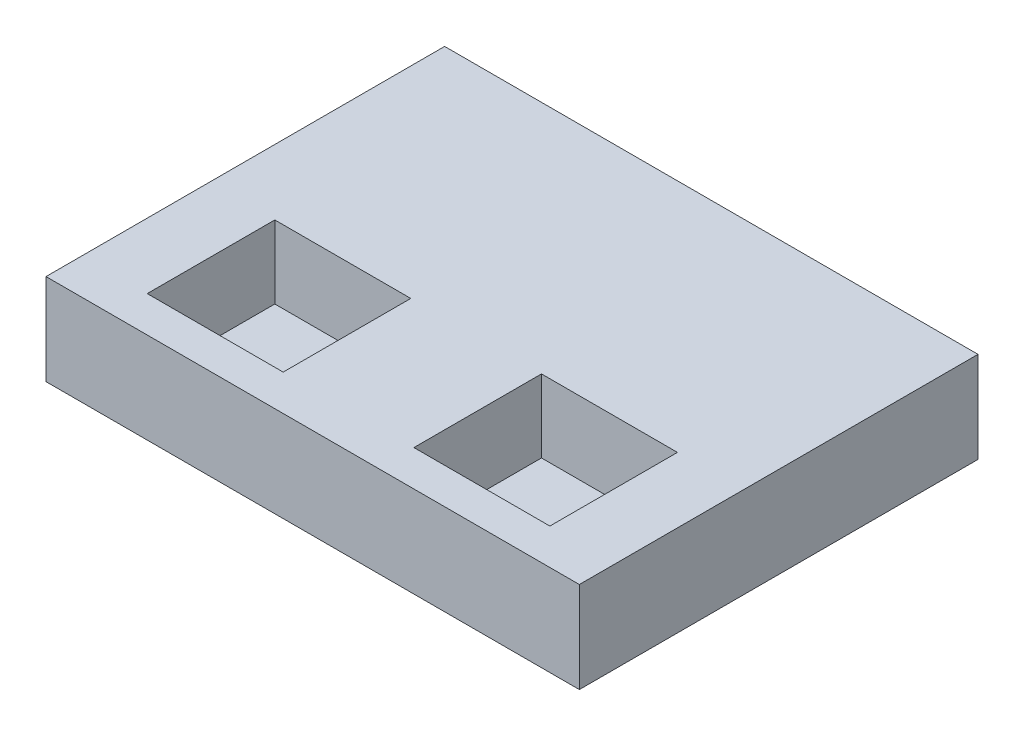
ISO-10303-21;
HEADER;
FILE_DESCRIPTION(('STEP AP214'),'2;1');
FILE_NAME('part.step','',(''),(''),'','','');
FILE_SCHEMA(('AUTOMOTIVE_DESIGN { 1 0 10303 214 1 1 1 1 }'));
ENDSEC;
DATA;
#1=APPLICATION_CONTEXT('core data for automotive mechanical design processes');
#2=APPLICATION_PROTOCOL_DEFINITION('international standard','automotive_design',2000,#1);
#3=PRODUCT_CONTEXT('',#1,'mechanical');
#4=PRODUCT('Part','Part','',(#3));
#5=PRODUCT_RELATED_PRODUCT_CATEGORY('part','',(#4));
#6=PRODUCT_DEFINITION_FORMATION('','',#4);
#7=PRODUCT_DEFINITION_CONTEXT('part definition',#1,'design');
#8=PRODUCT_DEFINITION('design','',#6,#7);
#9=PRODUCT_DEFINITION_SHAPE('','',#8);
#10=(LENGTH_UNIT() NAMED_UNIT(*) SI_UNIT(.MILLI.,.METRE.));
#11=(NAMED_UNIT(*) PLANE_ANGLE_UNIT() SI_UNIT($,.RADIAN.));
#12=(NAMED_UNIT(*) SI_UNIT($,.STERADIAN.) SOLID_ANGLE_UNIT());
#13=UNCERTAINTY_MEASURE_WITH_UNIT(LENGTH_MEASURE(1.E-05),#10,'distance_accuracy_value','');
#14=(GEOMETRIC_REPRESENTATION_CONTEXT(3) GLOBAL_UNCERTAINTY_ASSIGNED_CONTEXT((#13)) GLOBAL_UNIT_ASSIGNED_CONTEXT((#10,
#11,#12)) REPRESENTATION_CONTEXT('',''));
#15=CARTESIAN_POINT('',(0.,0.,0.));
#16=DIRECTION('',(0.,0.,1.));
#17=DIRECTION('',(1.,0.,0.));
#18=AXIS2_PLACEMENT_3D('',#15,#16,#17);
#19=CARTESIAN_POINT('',(146.5,50.,109.5));
#20=DIRECTION('',(-1.,0.,0.));
#21=DIRECTION('',(0.,0.,1.));
#22=AXIS2_PLACEMENT_3D('',#19,#20,#21);
#23=PLANE('',#22);
#24=DIRECTION('',(0.,0.,-1.));
#25=VECTOR('',#24,1.);
#26=CARTESIAN_POINT('',(146.5,0.,109.5));
#27=LINE('',#26,#25);
#28=CARTESIAN_POINT('',(146.5,0.,109.5));
#29=VERTEX_POINT('',#28);
#30=CARTESIAN_POINT('',(146.5,0.,-109.5));
#31=VERTEX_POINT('',#30);
#32=EDGE_CURVE('E161',#29,#31,#27,.T.);
#33=ORIENTED_EDGE('',*,*,#32,.T.);
#34=DIRECTION('',(0.,-1.,0.));
#35=VECTOR('',#34,1.);
#36=CARTESIAN_POINT('',(146.5,50.,-109.5));
#37=LINE('',#36,#35);
#38=CARTESIAN_POINT('',(146.5,50.,-109.5));
#39=VERTEX_POINT('',#38);
#40=EDGE_CURVE('E11',#39,#31,#37,.T.);
#41=ORIENTED_EDGE('',*,*,#40,.F.);
#42=DIRECTION('',(0.,0.,-1.));
#43=VECTOR('',#42,1.);
#44=CARTESIAN_POINT('',(146.5,50.,109.5));
#45=LINE('',#44,#43);
#46=CARTESIAN_POINT('',(146.5,50.,109.5));
#47=VERTEX_POINT('',#46);
#48=EDGE_CURVE('E194',#47,#39,#45,.T.);
#49=ORIENTED_EDGE('',*,*,#48,.F.);
#50=DIRECTION('',(0.,-1.,0.));
#51=VECTOR('',#50,1.);
#52=CARTESIAN_POINT('',(146.5,50.,109.5));
#53=LINE('',#52,#51);
#54=EDGE_CURVE('E204',#47,#29,#53,.T.);
#55=ORIENTED_EDGE('',*,*,#54,.T.);
#56=EDGE_LOOP('',(#33,#41,#49,#55));
#57=FACE_BOUND('',#56,.T.);
#58=ADVANCED_FACE('F37',(#57),#23,.F.);
#59=CARTESIAN_POINT('',(-146.5,50.,-109.5));
#60=DIRECTION('',(0.,0.,1.));
#61=DIRECTION('',(1.,0.,0.));
#62=AXIS2_PLACEMENT_3D('',#59,#60,#61);
#63=PLANE('',#62);
#64=DIRECTION('',(-1.,0.,0.));
#65=VECTOR('',#64,1.);
#66=CARTESIAN_POINT('',(-146.5,0.,-109.5));
#67=LINE('',#66,#65);
#68=CARTESIAN_POINT('',(-146.5,0.,-109.5));
#69=VERTEX_POINT('',#68);
#70=EDGE_CURVE('E207',#31,#69,#67,.T.);
#71=ORIENTED_EDGE('',*,*,#70,.T.);
#72=DIRECTION('',(0.,-1.,0.));
#73=VECTOR('',#72,1.);
#74=CARTESIAN_POINT('',(-146.5,50.,-109.5));
#75=LINE('',#74,#73);
#76=CARTESIAN_POINT('',(-146.5,50.,-109.5));
#77=VERTEX_POINT('',#76);
#78=EDGE_CURVE('E44',#77,#69,#75,.T.);
#79=ORIENTED_EDGE('',*,*,#78,.F.);
#80=DIRECTION('',(-1.,0.,0.));
#81=VECTOR('',#80,1.);
#82=CARTESIAN_POINT('',(-146.5,50.,-109.5));
#83=LINE('',#82,#81);
#84=EDGE_CURVE('E197',#39,#77,#83,.T.);
#85=ORIENTED_EDGE('',*,*,#84,.F.);
#86=ORIENTED_EDGE('',*,*,#40,.T.);
#87=EDGE_LOOP('',(#71,#79,#85,#86));
#88=FACE_BOUND('',#87,.T.);
#89=ADVANCED_FACE('F237',(#88),#63,.F.);
#90=CARTESIAN_POINT('',(-146.5,50.,109.5));
#91=DIRECTION('',(1.,0.,0.));
#92=DIRECTION('',(0.,0.,-1.));
#93=AXIS2_PLACEMENT_3D('',#90,#91,#92);
#94=PLANE('',#93);
#95=DIRECTION('',(0.,0.,1.));
#96=VECTOR('',#95,1.);
#97=CARTESIAN_POINT('',(-146.5,0.,109.5));
#98=LINE('',#97,#96);
#99=CARTESIAN_POINT('',(-146.5,0.,109.5));
#100=VERTEX_POINT('',#99);
#101=EDGE_CURVE('E209',#69,#100,#98,.T.);
#102=ORIENTED_EDGE('',*,*,#101,.T.);
#103=DIRECTION('',(0.,-1.,0.));
#104=VECTOR('',#103,1.);
#105=CARTESIAN_POINT('',(-146.5,50.,109.5));
#106=LINE('',#105,#104);
#107=CARTESIAN_POINT('',(-146.5,50.,109.5));
#108=VERTEX_POINT('',#107);
#109=EDGE_CURVE('E214',#108,#100,#106,.T.);
#110=ORIENTED_EDGE('',*,*,#109,.F.);
#111=DIRECTION('',(0.,0.,1.));
#112=VECTOR('',#111,1.);
#113=CARTESIAN_POINT('',(-146.5,50.,109.5));
#114=LINE('',#113,#112);
#115=EDGE_CURVE('E200',#77,#108,#114,.T.);
#116=ORIENTED_EDGE('',*,*,#115,.F.);
#117=ORIENTED_EDGE('',*,*,#78,.T.);
#118=EDGE_LOOP('',(#102,#110,#116,#117));
#119=FACE_BOUND('',#118,.T.);
#120=ADVANCED_FACE('F221',(#119),#94,.F.);
#121=CARTESIAN_POINT('',(-146.5,50.,109.5));
#122=DIRECTION('',(0.,0.,-1.));
#123=DIRECTION('',(-1.,0.,0.));
#124=AXIS2_PLACEMENT_3D('',#121,#122,#123);
#125=PLANE('',#124);
#126=DIRECTION('',(1.,0.,0.));
#127=VECTOR('',#126,1.);
#128=CARTESIAN_POINT('',(-146.5,0.,109.5));
#129=LINE('',#128,#127);
#130=EDGE_CURVE('E198',#100,#29,#129,.T.);
#131=ORIENTED_EDGE('',*,*,#130,.T.);
#132=ORIENTED_EDGE('',*,*,#54,.F.);
#133=DIRECTION('',(1.,0.,0.));
#134=VECTOR('',#133,1.);
#135=CARTESIAN_POINT('',(-146.5,50.,109.5));
#136=LINE('',#135,#134);
#137=EDGE_CURVE('E202',#108,#47,#136,.T.);
#138=ORIENTED_EDGE('',*,*,#137,.F.);
#139=ORIENTED_EDGE('',*,*,#109,.T.);
#140=EDGE_LOOP('',(#131,#132,#138,#139));
#141=FACE_BOUND('',#140,.T.);
#142=ADVANCED_FACE('F230',(#141),#125,.F.);
#143=CARTESIAN_POINT('',(0.,50.,0.));
#144=DIRECTION('',(0.,-1.,0.));
#145=DIRECTION('',(0.,0.,-1.));
#146=AXIS2_PLACEMENT_3D('',#143,#144,#145);
#147=PLANE('',#146);
#148=DIRECTION('',(-1.,0.,0.));
#149=VECTOR('',#148,1.);
#150=CARTESIAN_POINT('',(-110.595562934702,50.,19.7032534232194));
#151=LINE('',#150,#149);
#152=CARTESIAN_POINT('',(-35.9044370652981,50.,19.7032534232194));
#153=VERTEX_POINT('',#152);
#154=CARTESIAN_POINT('',(-110.595562934702,50.,19.7032534232194));
#155=VERTEX_POINT('',#154);
#156=EDGE_CURVE('E154',#153,#155,#151,.T.);
#157=ORIENTED_EDGE('',*,*,#156,.F.);
#158=DIRECTION('',(0.,0.,-1.));
#159=VECTOR('',#158,1.);
#160=CARTESIAN_POINT('',(-35.9044370652981,50.,19.7032534232194));
#161=LINE('',#160,#159);
#162=CARTESIAN_POINT('',(-35.9044370652981,50.,89.7967465767806));
#163=VERTEX_POINT('',#162);
#164=EDGE_CURVE('E51',#163,#153,#161,.T.);
#165=ORIENTED_EDGE('',*,*,#164,.F.);
#166=DIRECTION('',(1.,0.,0.));
#167=VECTOR('',#166,1.);
#168=CARTESIAN_POINT('',(-110.595562934702,50.,89.7967465767806));
#169=LINE('',#168,#167);
#170=CARTESIAN_POINT('',(-110.595562934702,50.,89.7967465767806));
#171=VERTEX_POINT('',#170);
#172=EDGE_CURVE('E145',#171,#163,#169,.T.);
#173=ORIENTED_EDGE('',*,*,#172,.F.);
#174=DIRECTION('',(0.,0.,1.));
#175=VECTOR('',#174,1.);
#176=CARTESIAN_POINT('',(-110.595562934702,50.,19.7032534232194));
#177=LINE('',#176,#175);
#178=EDGE_CURVE('E148',#155,#171,#177,.T.);
#179=ORIENTED_EDGE('',*,*,#178,.F.);
#180=EDGE_LOOP('',(#157,#165,#173,#179));
#181=FACE_BOUND('',#180,.T.);
#182=DIRECTION('',(-1.,0.,0.));
#183=VECTOR('',#182,1.);
#184=CARTESIAN_POINT('',(110.595562934702,50.,19.7032534232194));
#185=LINE('',#184,#183);
#186=CARTESIAN_POINT('',(110.595562934702,50.,19.7032534232194));
#187=VERTEX_POINT('',#186);
#188=CARTESIAN_POINT('',(35.9044370652981,50.,19.7032534232194));
#189=VERTEX_POINT('',#188);
#190=EDGE_CURVE('E180',#187,#189,#185,.T.);
#191=ORIENTED_EDGE('',*,*,#190,.F.);
#192=DIRECTION('',(0.,0.,-1.));
#193=VECTOR('',#192,1.);
#194=CARTESIAN_POINT('',(110.595562934702,50.,19.7032534232194));
#195=LINE('',#194,#193);
#196=CARTESIAN_POINT('',(110.595562934702,50.,89.7967465767806));
#197=VERTEX_POINT('',#196);
#198=EDGE_CURVE('E59',#197,#187,#195,.T.);
#199=ORIENTED_EDGE('',*,*,#198,.F.);
#200=DIRECTION('',(1.,0.,0.));
#201=VECTOR('',#200,1.);
#202=CARTESIAN_POINT('',(110.595562934702,50.,89.7967465767806));
#203=LINE('',#202,#201);
#204=CARTESIAN_POINT('',(35.9044370652981,50.,89.7967465767806));
#205=VERTEX_POINT('',#204);
#206=EDGE_CURVE('E169',#205,#197,#203,.T.);
#207=ORIENTED_EDGE('',*,*,#206,.F.);
#208=DIRECTION('',(0.,0.,1.));
#209=VECTOR('',#208,1.);
#210=CARTESIAN_POINT('',(35.9044370652981,50.,19.7032534232194));
#211=LINE('',#210,#209);
#212=EDGE_CURVE('E183',#189,#205,#211,.T.);
#213=ORIENTED_EDGE('',*,*,#212,.F.);
#214=EDGE_LOOP('',(#191,#199,#207,#213));
#215=FACE_BOUND('',#214,.T.);
#216=ORIENTED_EDGE('',*,*,#48,.T.);
#217=ORIENTED_EDGE('',*,*,#84,.T.);
#218=ORIENTED_EDGE('',*,*,#115,.T.);
#219=ORIENTED_EDGE('',*,*,#137,.T.);
#220=EDGE_LOOP('',(#216,#217,#218,#219));
#221=FACE_BOUND('',#220,.T.);
#222=ADVANCED_FACE('F236',(#181,#215,#221),#147,.F.);
#223=CARTESIAN_POINT('',(0.,0.,0.));
#224=DIRECTION('',(0.,-1.,0.));
#225=DIRECTION('',(0.,0.,-1.));
#226=AXIS2_PLACEMENT_3D('',#223,#224,#225);
#227=PLANE('',#226);
#228=ORIENTED_EDGE('',*,*,#32,.F.);
#229=ORIENTED_EDGE('',*,*,#130,.F.);
#230=ORIENTED_EDGE('',*,*,#101,.F.);
#231=ORIENTED_EDGE('',*,*,#70,.F.);
#232=EDGE_LOOP('',(#228,#229,#230,#231));
#233=FACE_BOUND('',#232,.T.);
#234=ADVANCED_FACE('F227',(#233),#227,.T.);
#235=CARTESIAN_POINT('',(110.595562934702,10.,19.7032534232194));
#236=DIRECTION('',(1.,0.,0.));
#237=DIRECTION('',(0.,0.,-1.));
#238=AXIS2_PLACEMENT_3D('',#235,#236,#237);
#239=PLANE('',#238);
#240=ORIENTED_EDGE('',*,*,#198,.T.);
#241=DIRECTION('',(0.,1.,0.));
#242=VECTOR('',#241,1.);
#243=CARTESIAN_POINT('',(110.595562934702,10.,19.7032534232194));
#244=LINE('',#243,#242);
#245=CARTESIAN_POINT('',(110.595562934702,10.,19.7032534232194));
#246=VERTEX_POINT('',#245);
#247=EDGE_CURVE('E178',#246,#187,#244,.T.);
#248=ORIENTED_EDGE('',*,*,#247,.F.);
#249=DIRECTION('',(0.,0.,-1.));
#250=VECTOR('',#249,1.);
#251=CARTESIAN_POINT('',(110.595562934702,10.,19.7032534232194));
#252=LINE('',#251,#250);
#253=CARTESIAN_POINT('',(110.595562934702,10.,89.7967465767806));
#254=VERTEX_POINT('',#253);
#255=EDGE_CURVE('E165',#254,#246,#252,.T.);
#256=ORIENTED_EDGE('',*,*,#255,.F.);
#257=DIRECTION('',(0.,1.,0.));
#258=VECTOR('',#257,1.);
#259=CARTESIAN_POINT('',(110.595562934702,10.,89.7967465767806));
#260=LINE('',#259,#258);
#261=EDGE_CURVE('E155',#254,#197,#260,.T.);
#262=ORIENTED_EDGE('',*,*,#261,.T.);
#263=EDGE_LOOP('',(#240,#248,#256,#262));
#264=FACE_BOUND('',#263,.T.);
#265=ADVANCED_FACE('F249',(#264),#239,.F.);
#266=CARTESIAN_POINT('',(110.595562934702,10.,89.7967465767806));
#267=DIRECTION('',(0.,0.,1.));
#268=DIRECTION('',(1.,0.,0.));
#269=AXIS2_PLACEMENT_3D('',#266,#267,#268);
#270=PLANE('',#269);
#271=ORIENTED_EDGE('',*,*,#206,.T.);
#272=ORIENTED_EDGE('',*,*,#261,.F.);
#273=DIRECTION('',(1.,0.,0.));
#274=VECTOR('',#273,1.);
#275=CARTESIAN_POINT('',(110.595562934702,10.,89.7967465767806));
#276=LINE('',#275,#274);
#277=CARTESIAN_POINT('',(35.9044370652981,10.,89.7967465767806));
#278=VERTEX_POINT('',#277);
#279=EDGE_CURVE('E175',#278,#254,#276,.T.);
#280=ORIENTED_EDGE('',*,*,#279,.F.);
#281=DIRECTION('',(0.,1.,0.));
#282=VECTOR('',#281,1.);
#283=CARTESIAN_POINT('',(35.9044370652981,10.,89.7967465767806));
#284=LINE('',#283,#282);
#285=EDGE_CURVE('E189',#278,#205,#284,.T.);
#286=ORIENTED_EDGE('',*,*,#285,.T.);
#287=EDGE_LOOP('',(#271,#272,#280,#286));
#288=FACE_BOUND('',#287,.T.);
#289=ADVANCED_FACE('F255',(#288),#270,.F.);
#290=CARTESIAN_POINT('',(35.9044370652981,10.,19.7032534232194));
#291=DIRECTION('',(-1.,0.,0.));
#292=DIRECTION('',(0.,0.,1.));
#293=AXIS2_PLACEMENT_3D('',#290,#291,#292);
#294=PLANE('',#293);
#295=ORIENTED_EDGE('',*,*,#212,.T.);
#296=ORIENTED_EDGE('',*,*,#285,.F.);
#297=DIRECTION('',(0.,0.,1.));
#298=VECTOR('',#297,1.);
#299=CARTESIAN_POINT('',(35.9044370652981,10.,19.7032534232194));
#300=LINE('',#299,#298);
#301=CARTESIAN_POINT('',(35.9044370652981,10.,19.7032534232194));
#302=VERTEX_POINT('',#301);
#303=EDGE_CURVE('E172',#302,#278,#300,.T.);
#304=ORIENTED_EDGE('',*,*,#303,.F.);
#305=DIRECTION('',(0.,1.,0.));
#306=VECTOR('',#305,1.);
#307=CARTESIAN_POINT('',(35.9044370652981,10.,19.7032534232194));
#308=LINE('',#307,#306);
#309=EDGE_CURVE('E191',#302,#189,#308,.T.);
#310=ORIENTED_EDGE('',*,*,#309,.T.);
#311=EDGE_LOOP('',(#295,#296,#304,#310));
#312=FACE_BOUND('',#311,.T.);
#313=ADVANCED_FACE('F260',(#312),#294,.F.);
#314=CARTESIAN_POINT('',(110.595562934702,10.,19.7032534232194));
#315=DIRECTION('',(0.,0.,-1.));
#316=DIRECTION('',(-1.,0.,0.));
#317=AXIS2_PLACEMENT_3D('',#314,#315,#316);
#318=PLANE('',#317);
#319=ORIENTED_EDGE('',*,*,#190,.T.);
#320=ORIENTED_EDGE('',*,*,#309,.F.);
#321=DIRECTION('',(-1.,0.,0.));
#322=VECTOR('',#321,1.);
#323=CARTESIAN_POINT('',(110.595562934702,10.,19.7032534232194));
#324=LINE('',#323,#322);
#325=EDGE_CURVE('E168',#246,#302,#324,.T.);
#326=ORIENTED_EDGE('',*,*,#325,.F.);
#327=ORIENTED_EDGE('',*,*,#247,.T.);
#328=EDGE_LOOP('',(#319,#320,#326,#327));
#329=FACE_BOUND('',#328,.T.);
#330=ADVANCED_FACE('F256',(#329),#318,.F.);
#331=CARTESIAN_POINT('',(0.,10.,0.));
#332=DIRECTION('',(0.,-1.,0.));
#333=DIRECTION('',(0.,0.,-1.));
#334=AXIS2_PLACEMENT_3D('',#331,#332,#333);
#335=PLANE('',#334);
#336=ORIENTED_EDGE('',*,*,#255,.T.);
#337=ORIENTED_EDGE('',*,*,#325,.T.);
#338=ORIENTED_EDGE('',*,*,#303,.T.);
#339=ORIENTED_EDGE('',*,*,#279,.T.);
#340=EDGE_LOOP('',(#336,#337,#338,#339));
#341=FACE_BOUND('',#340,.T.);
#342=ADVANCED_FACE('F259',(#341),#335,.F.);
#343=CARTESIAN_POINT('',(-35.9044370652981,10.,19.7032534232194));
#344=DIRECTION('',(1.,0.,0.));
#345=DIRECTION('',(0.,0.,-1.));
#346=AXIS2_PLACEMENT_3D('',#343,#344,#345);
#347=PLANE('',#346);
#348=ORIENTED_EDGE('',*,*,#164,.T.);
#349=DIRECTION('',(0.,1.,0.));
#350=VECTOR('',#349,1.);
#351=CARTESIAN_POINT('',(-35.9044370652981,10.,19.7032534232194));
#352=LINE('',#351,#350);
#353=CARTESIAN_POINT('',(-35.9044370652981,10.,19.7032534232194));
#354=VERTEX_POINT('',#353);
#355=EDGE_CURVE('E123',#354,#153,#352,.T.);
#356=ORIENTED_EDGE('',*,*,#355,.F.);
#357=DIRECTION('',(0.,0.,-1.));
#358=VECTOR('',#357,1.);
#359=CARTESIAN_POINT('',(-35.9044370652981,10.,19.7032534232194));
#360=LINE('',#359,#358);
#361=CARTESIAN_POINT('',(-35.9044370652981,10.,89.7967465767806));
#362=VERTEX_POINT('',#361);
#363=EDGE_CURVE('E127',#362,#354,#360,.T.);
#364=ORIENTED_EDGE('',*,*,#363,.F.);
#365=DIRECTION('',(0.,1.,0.));
#366=VECTOR('',#365,1.);
#367=CARTESIAN_POINT('',(-35.9044370652981,10.,89.7967465767806));
#368=LINE('',#367,#366);
#369=EDGE_CURVE('E159',#362,#163,#368,.T.);
#370=ORIENTED_EDGE('',*,*,#369,.T.);
#371=EDGE_LOOP('',(#348,#356,#364,#370));
#372=FACE_BOUND('',#371,.T.);
#373=ADVANCED_FACE('F125',(#372),#347,.F.);
#374=CARTESIAN_POINT('',(-110.595562934702,10.,89.7967465767806));
#375=DIRECTION('',(0.,0.,1.));
#376=DIRECTION('',(1.,0.,0.));
#377=AXIS2_PLACEMENT_3D('',#374,#375,#376);
#378=PLANE('',#377);
#379=ORIENTED_EDGE('',*,*,#172,.T.);
#380=ORIENTED_EDGE('',*,*,#369,.F.);
#381=DIRECTION('',(1.,0.,0.));
#382=VECTOR('',#381,1.);
#383=CARTESIAN_POINT('',(-110.595562934702,10.,89.7967465767806));
#384=LINE('',#383,#382);
#385=CARTESIAN_POINT('',(-110.595562934702,10.,89.7967465767806));
#386=VERTEX_POINT('',#385);
#387=EDGE_CURVE('E133',#386,#362,#384,.T.);
#388=ORIENTED_EDGE('',*,*,#387,.F.);
#389=DIRECTION('',(0.,1.,0.));
#390=VECTOR('',#389,1.);
#391=CARTESIAN_POINT('',(-110.595562934702,10.,89.7967465767806));
#392=LINE('',#391,#390);
#393=EDGE_CURVE('E162',#386,#171,#392,.T.);
#394=ORIENTED_EDGE('',*,*,#393,.T.);
#395=EDGE_LOOP('',(#379,#380,#388,#394));
#396=FACE_BOUND('',#395,.T.);
#397=ADVANCED_FACE('F273',(#396),#378,.F.);
#398=CARTESIAN_POINT('',(-110.595562934702,10.,19.7032534232194));
#399=DIRECTION('',(-1.,0.,0.));
#400=DIRECTION('',(0.,0.,1.));
#401=AXIS2_PLACEMENT_3D('',#398,#399,#400);
#402=PLANE('',#401);
#403=ORIENTED_EDGE('',*,*,#178,.T.);
#404=ORIENTED_EDGE('',*,*,#393,.F.);
#405=DIRECTION('',(0.,0.,1.));
#406=VECTOR('',#405,1.);
#407=CARTESIAN_POINT('',(-110.595562934702,10.,19.7032534232194));
#408=LINE('',#407,#406);
#409=CARTESIAN_POINT('',(-110.595562934702,10.,19.7032534232194));
#410=VERTEX_POINT('',#409);
#411=EDGE_CURVE('E141',#410,#386,#408,.T.);
#412=ORIENTED_EDGE('',*,*,#411,.F.);
#413=DIRECTION('',(0.,1.,0.));
#414=VECTOR('',#413,1.);
#415=CARTESIAN_POINT('',(-110.595562934702,10.,19.7032534232194));
#416=LINE('',#415,#414);
#417=EDGE_CURVE('E132',#410,#155,#416,.T.);
#418=ORIENTED_EDGE('',*,*,#417,.T.);
#419=EDGE_LOOP('',(#403,#404,#412,#418));
#420=FACE_BOUND('',#419,.T.);
#421=ADVANCED_FACE('F276',(#420),#402,.F.);
#422=CARTESIAN_POINT('',(-110.595562934702,10.,19.7032534232194));
#423=DIRECTION('',(0.,0.,-1.));
#424=DIRECTION('',(-1.,0.,0.));
#425=AXIS2_PLACEMENT_3D('',#422,#423,#424);
#426=PLANE('',#425);
#427=ORIENTED_EDGE('',*,*,#156,.T.);
#428=ORIENTED_EDGE('',*,*,#417,.F.);
#429=DIRECTION('',(-1.,0.,0.));
#430=VECTOR('',#429,1.);
#431=CARTESIAN_POINT('',(-110.595562934702,10.,19.7032534232194));
#432=LINE('',#431,#430);
#433=EDGE_CURVE('E136',#354,#410,#432,.T.);
#434=ORIENTED_EDGE('',*,*,#433,.F.);
#435=ORIENTED_EDGE('',*,*,#355,.T.);
#436=EDGE_LOOP('',(#427,#428,#434,#435));
#437=FACE_BOUND('',#436,.T.);
#438=ADVANCED_FACE('F137',(#437),#426,.F.);
#439=CARTESIAN_POINT('',(0.,10.,0.));
#440=DIRECTION('',(0.,1.,0.));
#441=DIRECTION('',(0.,0.,1.));
#442=AXIS2_PLACEMENT_3D('',#439,#440,#441);
#443=PLANE('',#442);
#444=ORIENTED_EDGE('',*,*,#363,.T.);
#445=ORIENTED_EDGE('',*,*,#433,.T.);
#446=ORIENTED_EDGE('',*,*,#411,.T.);
#447=ORIENTED_EDGE('',*,*,#387,.T.);
#448=EDGE_LOOP('',(#444,#445,#446,#447));
#449=FACE_BOUND('',#448,.T.);
#450=ADVANCED_FACE('F143',(#449),#443,.T.);
#451=CLOSED_SHELL('',(#58,#89,#120,#142,#222,#234,#265,#289,#313,#330,#342,#373,#397,#421,#438,#450));
#452=MANIFOLD_SOLID_BREP('B2',#451);
#453=ADVANCED_BREP_SHAPE_REPRESENTATION('',(#18,#452),#14);
#454=SHAPE_DEFINITION_REPRESENTATION(#9,#453);
ENDSEC;
END-ISO-10303-21;
